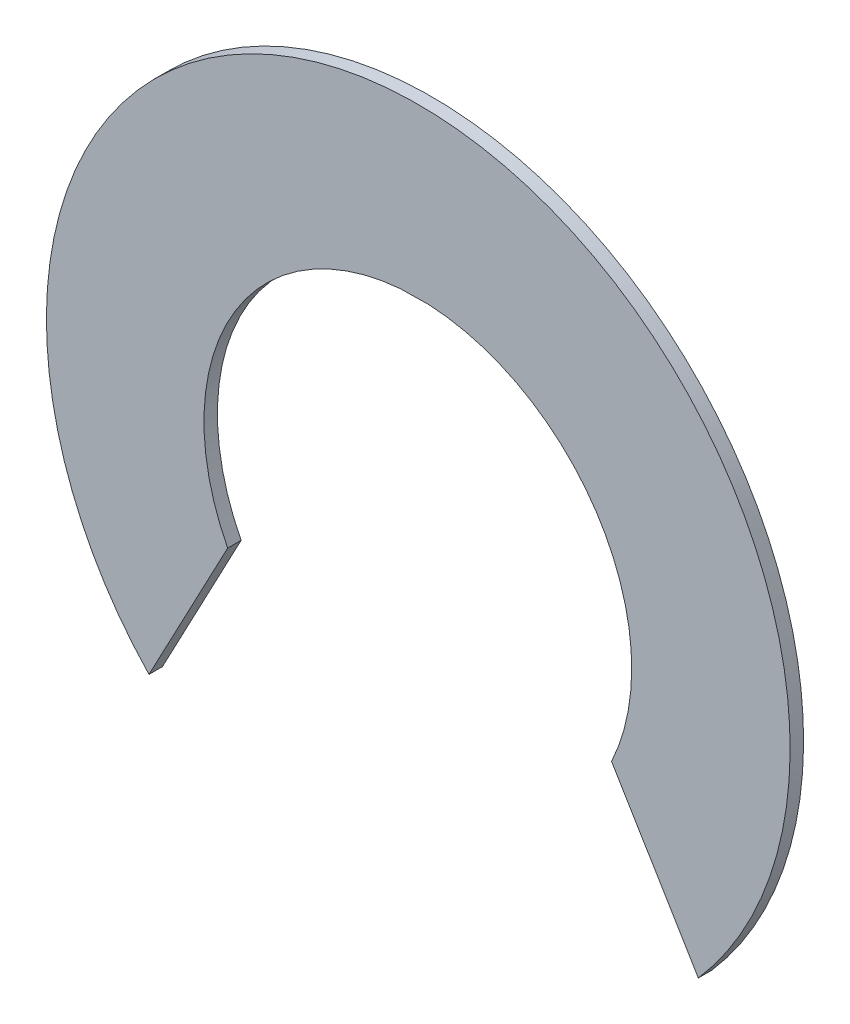
ISO-10303-21;
HEADER;
FILE_DESCRIPTION(('STEP AP214'),'2;1');
FILE_NAME('part.step','',(''),(''),'','','');
FILE_SCHEMA(('AUTOMOTIVE_DESIGN { 1 0 10303 214 1 1 1 1 }'));
ENDSEC;
DATA;
#1=APPLICATION_CONTEXT('core data for automotive mechanical design processes');
#2=APPLICATION_PROTOCOL_DEFINITION('international standard','automotive_design',2000,#1);
#3=PRODUCT_CONTEXT('',#1,'mechanical');
#4=PRODUCT('Part','Part','',(#3));
#5=PRODUCT_RELATED_PRODUCT_CATEGORY('part','',(#4));
#6=PRODUCT_DEFINITION_FORMATION('','',#4);
#7=PRODUCT_DEFINITION_CONTEXT('part definition',#1,'design');
#8=PRODUCT_DEFINITION('design','',#6,#7);
#9=PRODUCT_DEFINITION_SHAPE('','',#8);
#10=(LENGTH_UNIT() NAMED_UNIT(*) SI_UNIT(.MILLI.,.METRE.));
#11=(NAMED_UNIT(*) PLANE_ANGLE_UNIT() SI_UNIT($,.RADIAN.));
#12=(NAMED_UNIT(*) SI_UNIT($,.STERADIAN.) SOLID_ANGLE_UNIT());
#13=UNCERTAINTY_MEASURE_WITH_UNIT(LENGTH_MEASURE(1.E-05),#10,'distance_accuracy_value','');
#14=(GEOMETRIC_REPRESENTATION_CONTEXT(3) GLOBAL_UNCERTAINTY_ASSIGNED_CONTEXT((#13)) GLOBAL_UNIT_ASSIGNED_CONTEXT((#10,
#11,#12)) REPRESENTATION_CONTEXT('',''));
#15=CARTESIAN_POINT('',(0.,0.,0.));
#16=DIRECTION('',(0.,0.,1.));
#17=DIRECTION('',(1.,0.,0.));
#18=AXIS2_PLACEMENT_3D('',#15,#16,#17);
#19=CARTESIAN_POINT('',(0.120201581885716,1.82586712880829,4.));
#20=DIRECTION('',(0.,0.,-1.));
#21=DIRECTION('',(-1.,0.,0.));
#22=AXIS2_PLACEMENT_3D('',#19,#20,#21);
#23=CYLINDRICAL_SURFACE('',#22,110.492778660301);
#24=CARTESIAN_POINT('',(0.120201581885716,1.82586712880829,0.));
#25=DIRECTION('',(0.,0.,1.));
#26=DIRECTION('',(-1.,0.,0.));
#27=AXIS2_PLACEMENT_3D('',#24,#25,#26);
#28=CIRCLE('',#27,110.492778660301);
#29=CARTESIAN_POINT('',(83.3374505013354,-70.8621210009543,0.));
#30=VERTEX_POINT('',#29);
#31=CARTESIAN_POINT('',(-79.9001757110114,-74.3672648056158,0.));
#32=VERTEX_POINT('',#31);
#33=EDGE_CURVE('E117',#30,#32,#28,.T.);
#34=ORIENTED_EDGE('',*,*,#33,.T.);
#35=DIRECTION('',(0.,0.,-1.));
#36=VECTOR('',#35,1.);
#37=CARTESIAN_POINT('',(-79.9001757110114,-74.3672648056158,4.));
#38=LINE('',#37,#36);
#39=CARTESIAN_POINT('',(-79.9001757110114,-74.3672648056158,4.));
#40=VERTEX_POINT('',#39);
#41=EDGE_CURVE('E11',#40,#32,#38,.T.);
#42=ORIENTED_EDGE('',*,*,#41,.F.);
#43=CARTESIAN_POINT('',(0.120201581885716,1.82586712880829,4.));
#44=DIRECTION('',(0.,0.,1.));
#45=DIRECTION('',(-1.,0.,0.));
#46=AXIS2_PLACEMENT_3D('',#43,#44,#45);
#47=CIRCLE('',#46,110.492778660301);
#48=CARTESIAN_POINT('',(83.3374505013354,-70.8621210009543,4.));
#49=VERTEX_POINT('',#48);
#50=EDGE_CURVE('E127',#49,#40,#47,.T.);
#51=ORIENTED_EDGE('',*,*,#50,.F.);
#52=DIRECTION('',(0.,0.,-1.));
#53=VECTOR('',#52,1.);
#54=CARTESIAN_POINT('',(83.3374505013354,-70.8621210009543,4.));
#55=LINE('',#54,#53);
#56=EDGE_CURVE('E113',#49,#30,#55,.T.);
#57=ORIENTED_EDGE('',*,*,#56,.T.);
#58=EDGE_LOOP('',(#34,#42,#51,#57));
#59=FACE_BOUND('',#58,.T.);
#60=ADVANCED_FACE('F33',(#59),#23,.T.);
#61=CARTESIAN_POINT('',(-56.5167463392951,-30.1720701480746,4.));
#62=DIRECTION('',(-0.883903893150824,0.467668587434325,0.));
#63=DIRECTION('',(-0.467668587434325,-0.883903893150824,0.));
#64=AXIS2_PLACEMENT_3D('',#61,#62,#63);
#65=PLANE('',#64);
#66=DIRECTION('',(0.467668587434325,0.883903893150824,0.));
#67=VECTOR('',#66,1.);
#68=CARTESIAN_POINT('',(-56.5167463392951,-30.1720701480746,0.));
#69=LINE('',#68,#67);
#70=CARTESIAN_POINT('',(-56.5167463392951,-30.1720701480746,0.));
#71=VERTEX_POINT('',#70);
#72=EDGE_CURVE('E120',#32,#71,#69,.T.);
#73=ORIENTED_EDGE('',*,*,#72,.T.);
#74=DIRECTION('',(0.,0.,-1.));
#75=VECTOR('',#74,1.);
#76=CARTESIAN_POINT('',(-56.5167463392951,-30.1720701480746,4.));
#77=LINE('',#76,#75);
#78=CARTESIAN_POINT('',(-56.5167463392951,-30.1720701480746,4.));
#79=VERTEX_POINT('',#78);
#80=EDGE_CURVE('E41',#79,#71,#77,.T.);
#81=ORIENTED_EDGE('',*,*,#80,.F.);
#82=DIRECTION('',(0.467668587434325,0.883903893150824,0.));
#83=VECTOR('',#82,1.);
#84=CARTESIAN_POINT('',(-56.5167463392951,-30.1720701480746,4.));
#85=LINE('',#84,#83);
#86=EDGE_CURVE('E86',#40,#79,#85,.T.);
#87=ORIENTED_EDGE('',*,*,#86,.F.);
#88=ORIENTED_EDGE('',*,*,#41,.T.);
#89=EDGE_LOOP('',(#73,#81,#87,#88));
#90=FACE_BOUND('',#89,.T.);
#91=ADVANCED_FACE('F151',(#90),#65,.F.);
#92=CARTESIAN_POINT('',(-0.010290827645716,-1.09353234414935,4.));
#93=DIRECTION('',(0.,0.,-1.));
#94=DIRECTION('',(-1.,0.,0.));
#95=AXIS2_PLACEMENT_3D('',#92,#93,#94);
#96=CYLINDRICAL_SURFACE('',#95,63.5495151460995);
#97=CARTESIAN_POINT('',(-0.010290827645716,-1.09353234414935,0.));
#98=DIRECTION('',(0.,0.,-1.));
#99=DIRECTION('',(-1.,0.,0.));
#100=AXIS2_PLACEMENT_3D('',#97,#98,#99);
#101=CIRCLE('',#100,63.5495151460995);
#102=CARTESIAN_POINT('',(-5.39769883916746,62.2272123626347,0.));
#103=VERTEX_POINT('',#102);
#104=EDGE_CURVE('E122',#71,#103,#101,.T.);
#105=ORIENTED_EDGE('',*,*,#104,.T.);
#106=DIRECTION('',(0.,0.,-1.));
#107=VECTOR('',#106,1.);
#108=CARTESIAN_POINT('',(-5.39769883916746,62.2272123626347,4.));
#109=LINE('',#108,#107);
#110=CARTESIAN_POINT('',(-5.39769883916746,62.2272123626347,4.));
#111=VERTEX_POINT('',#110);
#112=EDGE_CURVE('E108',#111,#103,#109,.T.);
#113=ORIENTED_EDGE('',*,*,#112,.F.);
#114=CARTESIAN_POINT('',(-0.010290827645716,-1.09353234414935,4.));
#115=DIRECTION('',(0.,0.,-1.));
#116=DIRECTION('',(-1.,0.,0.));
#117=AXIS2_PLACEMENT_3D('',#114,#115,#116);
#118=CIRCLE('',#117,63.5495151460995);
#119=EDGE_CURVE('E99',#79,#111,#118,.T.);
#120=ORIENTED_EDGE('',*,*,#119,.F.);
#121=ORIENTED_EDGE('',*,*,#80,.T.);
#122=EDGE_LOOP('',(#105,#113,#120,#121));
#123=FACE_BOUND('',#122,.T.);
#124=ADVANCED_FACE('F133',(#123),#96,.F.);
#125=CARTESIAN_POINT('',(-5.39769883916746,62.2272123626347,4.));
#126=DIRECTION('',(-0.0177186701065962,0.999843012042217,0.));
#127=DIRECTION('',(-0.999843012042217,-0.0177186701065962,0.));
#128=AXIS2_PLACEMENT_3D('',#125,#126,#127);
#129=PLANE('',#128);
#130=DIRECTION('',(0.999843012042217,0.0177186701065962,0.));
#131=VECTOR('',#130,1.);
#132=CARTESIAN_POINT('',(-5.39769883916746,62.2272123626347,0.));
#133=LINE('',#132,#131);
#134=CARTESIAN_POINT('',(3.13016791219685,62.3783385453059,0.));
#135=VERTEX_POINT('',#134);
#136=EDGE_CURVE('E107',#103,#135,#133,.T.);
#137=ORIENTED_EDGE('',*,*,#136,.T.);
#138=DIRECTION('',(0.,0.,-1.));
#139=VECTOR('',#138,1.);
#140=CARTESIAN_POINT('',(3.13016791219685,62.3783385453059,4.));
#141=LINE('',#140,#139);
#142=CARTESIAN_POINT('',(3.13016791219685,62.3783385453059,4.));
#143=VERTEX_POINT('',#142);
#144=EDGE_CURVE('E104',#143,#135,#141,.T.);
#145=ORIENTED_EDGE('',*,*,#144,.F.);
#146=DIRECTION('',(0.999843012042217,0.0177186701065962,0.));
#147=VECTOR('',#146,1.);
#148=CARTESIAN_POINT('',(-5.39769883916746,62.2272123626347,4.));
#149=LINE('',#148,#147);
#150=EDGE_CURVE('E93',#111,#143,#149,.T.);
#151=ORIENTED_EDGE('',*,*,#150,.F.);
#152=ORIENTED_EDGE('',*,*,#112,.T.);
#153=EDGE_LOOP('',(#137,#145,#151,#152));
#154=FACE_BOUND('',#153,.T.);
#155=ADVANCED_FACE('F105',(#154),#129,.F.);
#156=CARTESIAN_POINT('',(-0.010290827645716,-1.09353234414935,4.));
#157=DIRECTION('',(0.,0.,-1.));
#158=DIRECTION('',(-1.,0.,0.));
#159=AXIS2_PLACEMENT_3D('',#156,#157,#158);
#160=CYLINDRICAL_SURFACE('',#159,63.5495151460995);
#161=CARTESIAN_POINT('',(-0.010290827645716,-1.09353234414935,0.));
#162=DIRECTION('',(0.,0.,-1.));
#163=DIRECTION('',(-1.,0.,0.));
#164=AXIS2_PLACEMENT_3D('',#161,#162,#163);
#165=CIRCLE('',#164,63.5495151460995);
#166=CARTESIAN_POINT('',(57.5505150211956,-28.0248246513582,0.));
#167=VERTEX_POINT('',#166);
#168=EDGE_CURVE('E72',#135,#167,#165,.T.);
#169=ORIENTED_EDGE('',*,*,#168,.T.);
#170=DIRECTION('',(0.,0.,-1.));
#171=VECTOR('',#170,1.);
#172=CARTESIAN_POINT('',(57.5505150211956,-28.0248246513582,4.));
#173=LINE('',#172,#171);
#174=CARTESIAN_POINT('',(57.5505150211956,-28.0248246513582,4.));
#175=VERTEX_POINT('',#174);
#176=EDGE_CURVE('E109',#175,#167,#173,.T.);
#177=ORIENTED_EDGE('',*,*,#176,.F.);
#178=CARTESIAN_POINT('',(-0.010290827645716,-1.09353234414935,4.));
#179=DIRECTION('',(0.,0.,-1.));
#180=DIRECTION('',(-1.,0.,0.));
#181=AXIS2_PLACEMENT_3D('',#178,#179,#180);
#182=CIRCLE('',#181,63.5495151460995);
#183=EDGE_CURVE('E97',#143,#175,#182,.T.);
#184=ORIENTED_EDGE('',*,*,#183,.F.);
#185=ORIENTED_EDGE('',*,*,#144,.T.);
#186=EDGE_LOOP('',(#169,#177,#184,#185));
#187=FACE_BOUND('',#186,.T.);
#188=ADVANCED_FACE('F111',(#187),#160,.F.);
#189=CARTESIAN_POINT('',(57.5505150211956,-28.0248246513582,4.));
#190=DIRECTION('',(0.85674592699192,0.515738709602795,0.));
#191=DIRECTION('',(-0.515738709602795,0.85674592699192,0.));
#192=AXIS2_PLACEMENT_3D('',#189,#190,#191);
#193=PLANE('',#192);
#194=DIRECTION('',(0.515738709602795,-0.85674592699192,0.));
#195=VECTOR('',#194,1.);
#196=CARTESIAN_POINT('',(57.5505150211956,-28.0248246513582,0.));
#197=LINE('',#196,#195);
#198=EDGE_CURVE('E78',#167,#30,#197,.T.);
#199=ORIENTED_EDGE('',*,*,#198,.T.);
#200=ORIENTED_EDGE('',*,*,#56,.F.);
#201=DIRECTION('',(0.515738709602795,-0.85674592699192,0.));
#202=VECTOR('',#201,1.);
#203=CARTESIAN_POINT('',(57.5505150211956,-28.0248246513582,4.));
#204=LINE('',#203,#202);
#205=EDGE_CURVE('E49',#175,#49,#204,.T.);
#206=ORIENTED_EDGE('',*,*,#205,.F.);
#207=ORIENTED_EDGE('',*,*,#176,.T.);
#208=EDGE_LOOP('',(#199,#200,#206,#207));
#209=FACE_BOUND('',#208,.T.);
#210=ADVANCED_FACE('F140',(#209),#193,.F.);
#211=CARTESIAN_POINT('',(0.120201581885716,1.82586712880829,4.));
#212=DIRECTION('',(0.,0.,-1.));
#213=DIRECTION('',(-1.,0.,0.));
#214=AXIS2_PLACEMENT_3D('',#211,#212,#213);
#215=PLANE('',#214);
#216=ORIENTED_EDGE('',*,*,#50,.T.);
#217=ORIENTED_EDGE('',*,*,#86,.T.);
#218=ORIENTED_EDGE('',*,*,#119,.T.);
#219=ORIENTED_EDGE('',*,*,#150,.T.);
#220=ORIENTED_EDGE('',*,*,#183,.T.);
#221=ORIENTED_EDGE('',*,*,#205,.T.);
#222=EDGE_LOOP('',(#216,#217,#218,#219,#220,#221));
#223=FACE_BOUND('',#222,.T.);
#224=ADVANCED_FACE('F95',(#223),#215,.F.);
#225=CARTESIAN_POINT('',(0.120201581885716,1.82586712880829,0.));
#226=DIRECTION('',(0.,0.,-1.));
#227=DIRECTION('',(-1.,0.,0.));
#228=AXIS2_PLACEMENT_3D('',#225,#226,#227);
#229=PLANE('',#228);
#230=ORIENTED_EDGE('',*,*,#33,.F.);
#231=ORIENTED_EDGE('',*,*,#198,.F.);
#232=ORIENTED_EDGE('',*,*,#168,.F.);
#233=ORIENTED_EDGE('',*,*,#136,.F.);
#234=ORIENTED_EDGE('',*,*,#104,.F.);
#235=ORIENTED_EDGE('',*,*,#72,.F.);
#236=EDGE_LOOP('',(#230,#231,#232,#233,#234,#235));
#237=FACE_BOUND('',#236,.T.);
#238=ADVANCED_FACE('F136',(#237),#229,.T.);
#239=CLOSED_SHELL('',(#60,#91,#124,#155,#188,#210,#224,#238));
#240=MANIFOLD_SOLID_BREP('B2',#239);
#241=ADVANCED_BREP_SHAPE_REPRESENTATION('',(#18,#240),#14);
#242=SHAPE_DEFINITION_REPRESENTATION(#9,#241);
ENDSEC;
END-ISO-10303-21;
